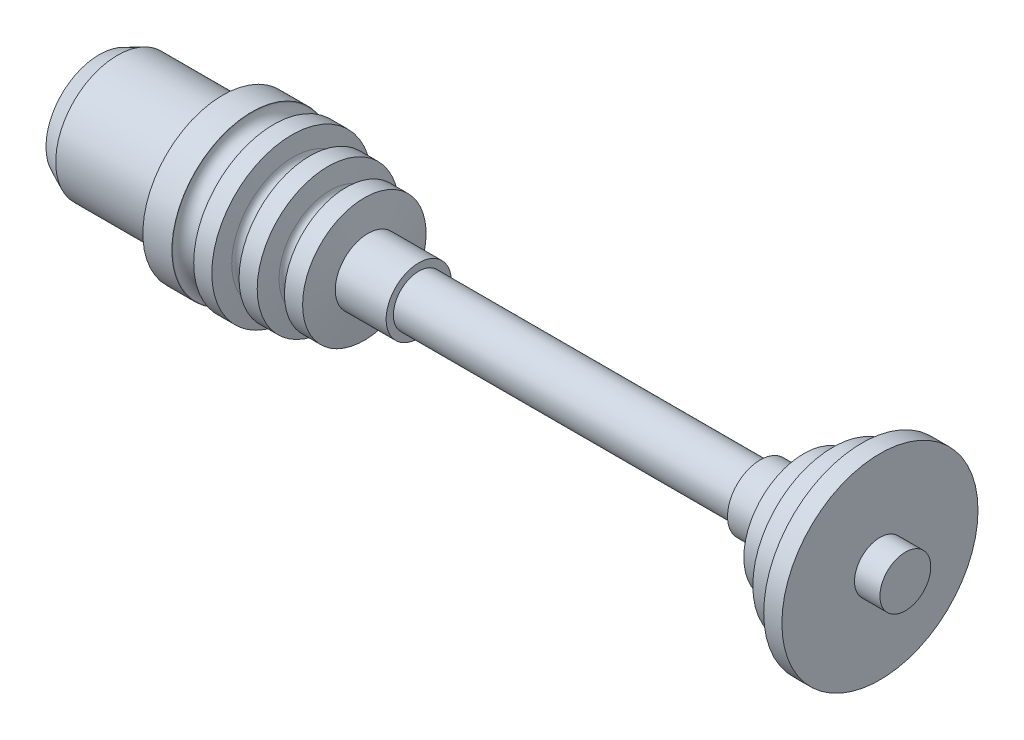
ISO-10303-21;
HEADER;
FILE_DESCRIPTION(('STEP AP214'),'2;1');
FILE_NAME('part.step','',(''),(''),'','','');
FILE_SCHEMA(('AUTOMOTIVE_DESIGN { 1 0 10303 214 1 1 1 1 }'));
ENDSEC;
DATA;
#1=APPLICATION_CONTEXT('core data for automotive mechanical design processes');
#2=APPLICATION_PROTOCOL_DEFINITION('international standard','automotive_design',2000,#1);
#3=PRODUCT_CONTEXT('',#1,'mechanical');
#4=PRODUCT('Part','Part','',(#3));
#5=PRODUCT_RELATED_PRODUCT_CATEGORY('part','',(#4));
#6=PRODUCT_DEFINITION_FORMATION('','',#4);
#7=PRODUCT_DEFINITION_CONTEXT('part definition',#1,'design');
#8=PRODUCT_DEFINITION('design','',#6,#7);
#9=PRODUCT_DEFINITION_SHAPE('','',#8);
#10=(LENGTH_UNIT() NAMED_UNIT(*) SI_UNIT(.MILLI.,.METRE.));
#11=(NAMED_UNIT(*) PLANE_ANGLE_UNIT() SI_UNIT($,.RADIAN.));
#12=(NAMED_UNIT(*) SI_UNIT($,.STERADIAN.) SOLID_ANGLE_UNIT());
#13=UNCERTAINTY_MEASURE_WITH_UNIT(LENGTH_MEASURE(1.E-05),#10,'distance_accuracy_value','');
#14=(GEOMETRIC_REPRESENTATION_CONTEXT(3) GLOBAL_UNCERTAINTY_ASSIGNED_CONTEXT((#13)) GLOBAL_UNIT_ASSIGNED_CONTEXT((#10,
#11,#12)) REPRESENTATION_CONTEXT('',''));
#15=CARTESIAN_POINT('',(0.,0.,0.));
#16=DIRECTION('',(0.,0.,1.));
#17=DIRECTION('',(1.,0.,0.));
#18=AXIS2_PLACEMENT_3D('',#15,#16,#17);
#19=CARTESIAN_POINT('',(2.9,0.,0.));
#20=DIRECTION('',(-1.,0.,0.));
#21=DIRECTION('',(0.,0.,1.));
#22=AXIS2_PLACEMENT_3D('',#19,#20,#21);
#23=CYLINDRICAL_SURFACE('',#22,1.7);
#24=CARTESIAN_POINT('',(2.9,0.,0.));
#25=DIRECTION('',(1.,0.,0.));
#26=DIRECTION('',(0.,0.,-1.));
#27=AXIS2_PLACEMENT_3D('',#24,#25,#26);
#28=CIRCLE('',#27,1.7);
#29=CARTESIAN_POINT('',(2.9,0.,-1.7));
#30=VERTEX_POINT('',#29);
#31=EDGE_CURVE('E61',#30,#30,#28,.T.);
#32=ORIENTED_EDGE('',*,*,#31,.F.);
#33=EDGE_LOOP('',(#32));
#34=FACE_BOUND('',#33,.T.);
#35=CARTESIAN_POINT('',(0.,0.,0.));
#36=DIRECTION('',(1.,0.,0.));
#37=DIRECTION('',(0.,0.,-1.));
#38=AXIS2_PLACEMENT_3D('',#35,#36,#37);
#39=CIRCLE('',#38,1.7);
#40=CARTESIAN_POINT('',(0.,0.,-1.7));
#41=VERTEX_POINT('',#40);
#42=EDGE_CURVE('E118',#41,#41,#39,.T.);
#43=ORIENTED_EDGE('',*,*,#42,.T.);
#44=EDGE_LOOP('',(#43));
#45=FACE_BOUND('',#44,.T.);
#46=ADVANCED_FACE('F50',(#34,#45),#23,.T.);
#47=CARTESIAN_POINT('',(3.7,0.,0.));
#48=DIRECTION('',(-1.,0.,0.));
#49=DIRECTION('',(0.,0.,1.));
#50=AXIS2_PLACEMENT_3D('',#47,#48,#49);
#51=CYLINDRICAL_SURFACE('',#50,2.2);
#52=CARTESIAN_POINT('',(3.7,0.,0.));
#53=DIRECTION('',(1.,0.,0.));
#54=DIRECTION('',(0.,0.,-1.));
#55=AXIS2_PLACEMENT_3D('',#52,#53,#54);
#56=CIRCLE('',#55,2.2);
#57=CARTESIAN_POINT('',(3.7,0.,-2.2));
#58=VERTEX_POINT('',#57);
#59=EDGE_CURVE('E103',#58,#58,#56,.T.);
#60=ORIENTED_EDGE('',*,*,#59,.F.);
#61=EDGE_LOOP('',(#60));
#62=FACE_BOUND('',#61,.T.);
#63=CARTESIAN_POINT('',(2.9,0.,0.));
#64=DIRECTION('',(1.,0.,0.));
#65=DIRECTION('',(0.,0.,-1.));
#66=AXIS2_PLACEMENT_3D('',#63,#64,#65);
#67=CIRCLE('',#66,2.2);
#68=CARTESIAN_POINT('',(2.9,0.,-2.2));
#69=VERTEX_POINT('',#68);
#70=EDGE_CURVE('E102',#69,#69,#67,.T.);
#71=ORIENTED_EDGE('',*,*,#70,.T.);
#72=EDGE_LOOP('',(#71));
#73=FACE_BOUND('',#72,.T.);
#74=ADVANCED_FACE('F115',(#62,#73),#51,.T.);
#75=CARTESIAN_POINT('',(3.7,0.,0.));
#76=DIRECTION('',(1.,0.,0.));
#77=DIRECTION('',(0.,0.,-1.));
#78=AXIS2_PLACEMENT_3D('',#75,#76,#77);
#79=PLANE('',#78);
#80=CARTESIAN_POINT('',(3.7,0.,0.));
#81=DIRECTION('',(-1.,0.,0.));
#82=DIRECTION('',(0.,0.,1.));
#83=AXIS2_PLACEMENT_3D('',#80,#81,#82);
#84=CIRCLE('',#83,2.18446778680125);
#85=CARTESIAN_POINT('',(3.7,0.,2.18446778680125));
#86=VERTEX_POINT('',#85);
#87=EDGE_CURVE('E53',#86,#86,#84,.F.);
#88=ORIENTED_EDGE('',*,*,#87,.F.);
#89=EDGE_LOOP('',(#88));
#90=FACE_BOUND('',#89,.T.);
#91=ORIENTED_EDGE('',*,*,#59,.T.);
#92=EDGE_LOOP('',(#91));
#93=FACE_BOUND('',#92,.T.);
#94=ADVANCED_FACE('F242',(#90,#93),#79,.T.);
#95=CARTESIAN_POINT('',(2.9,0.,0.));
#96=DIRECTION('',(1.,0.,0.));
#97=DIRECTION('',(0.,0.,-1.));
#98=AXIS2_PLACEMENT_3D('',#95,#96,#97);
#99=PLANE('',#98);
#100=ORIENTED_EDGE('',*,*,#31,.T.);
#101=EDGE_LOOP('',(#100));
#102=FACE_BOUND('',#101,.T.);
#103=ORIENTED_EDGE('',*,*,#70,.F.);
#104=EDGE_LOOP('',(#103));
#105=FACE_BOUND('',#104,.T.);
#106=ADVANCED_FACE('F110',(#102,#105),#99,.F.);
#107=CARTESIAN_POINT('',(6.04664733794712,0.,0.));
#108=DIRECTION('',(-1.,0.,0.));
#109=DIRECTION('',(0.,0.,1.));
#110=AXIS2_PLACEMENT_3D('',#107,#108,#109);
#111=TOROIDAL_SURFACE('',#110,1.43064535522847,0.188756587312078);
#112=CARTESIAN_POINT('',(6.23422555180458,0.,0.));
#113=DIRECTION('',(-1.,0.,0.));
#114=DIRECTION('',(0.,0.,1.));
#115=AXIS2_PLACEMENT_3D('',#112,#113,#114);
#116=CIRCLE('',#115,1.40958679545468);
#117=CARTESIAN_POINT('',(6.23422555180458,0.,1.40958679545468));
#118=VERTEX_POINT('',#117);
#119=EDGE_CURVE('E66',#118,#118,#116,.T.);
#120=ORIENTED_EDGE('',*,*,#119,.T.);
#121=EDGE_LOOP('',(#120));
#122=FACE_BOUND('',#121,.T.);
#123=CARTESIAN_POINT('',(5.85906912408965,0.,0.));
#124=DIRECTION('',(-1.,0.,0.));
#125=DIRECTION('',(0.,0.,1.));
#126=AXIS2_PLACEMENT_3D('',#123,#124,#125);
#127=CIRCLE('',#126,1.40958679545468);
#128=CARTESIAN_POINT('',(5.85906912408965,0.,1.40958679545468));
#129=VERTEX_POINT('',#128);
#130=EDGE_CURVE('E99',#129,#129,#127,.T.);
#131=ORIENTED_EDGE('',*,*,#130,.F.);
#132=EDGE_LOOP('',(#131));
#133=FACE_BOUND('',#132,.T.);
#134=ADVANCED_FACE('F237',(#122,#133),#111,.F.);
#135=CARTESIAN_POINT('',(5.79839937179576,0.,0.));
#136=DIRECTION('',(-1.,0.,0.));
#137=DIRECTION('',(0.,0.,1.));
#138=AXIS2_PLACEMENT_3D('',#135,#136,#137);
#139=CONICAL_SURFACE('',#138,1.95,1.45899895115095);
#140=ORIENTED_EDGE('',*,*,#130,.T.);
#141=EDGE_LOOP('',(#140));
#142=FACE_BOUND('',#141,.T.);
#143=CARTESIAN_POINT('',(5.79839937179576,0.,0.));
#144=DIRECTION('',(-1.,0.,0.));
#145=DIRECTION('',(0.,0.,1.));
#146=AXIS2_PLACEMENT_3D('',#143,#144,#145);
#147=CIRCLE('',#146,1.95);
#148=CARTESIAN_POINT('',(5.79839937179576,0.,1.95));
#149=VERTEX_POINT('',#148);
#150=EDGE_CURVE('E96',#149,#149,#147,.T.);
#151=ORIENTED_EDGE('',*,*,#150,.F.);
#152=EDGE_LOOP('',(#151));
#153=FACE_BOUND('',#152,.T.);
#154=ADVANCED_FACE('F233',(#142,#153),#139,.T.);
#155=CARTESIAN_POINT('',(-29.13128668451,0.,0.));
#156=DIRECTION('',(-1.,0.,0.));
#157=DIRECTION('',(0.,0.,1.));
#158=AXIS2_PLACEMENT_3D('',#155,#156,#157);
#159=CYLINDRICAL_SURFACE('',#158,1.95);
#160=ORIENTED_EDGE('',*,*,#150,.T.);
#161=EDGE_LOOP('',(#160));
#162=FACE_BOUND('',#161,.T.);
#163=CARTESIAN_POINT('',(5.29839937179576,0.,0.));
#164=DIRECTION('',(-1.,0.,0.));
#165=DIRECTION('',(0.,0.,1.));
#166=AXIS2_PLACEMENT_3D('',#163,#164,#165);
#167=CIRCLE('',#166,1.95);
#168=CARTESIAN_POINT('',(5.29839937179576,0.,1.95));
#169=VERTEX_POINT('',#168);
#170=EDGE_CURVE('E93',#169,#169,#167,.T.);
#171=ORIENTED_EDGE('',*,*,#170,.F.);
#172=EDGE_LOOP('',(#171));
#173=FACE_BOUND('',#172,.T.);
#174=ADVANCED_FACE('F229',(#162,#173),#159,.T.);
#175=CARTESIAN_POINT('',(5.29839937179576,0.,0.));
#176=DIRECTION('',(1.,0.,0.));
#177=DIRECTION('',(0.,0.,-1.));
#178=AXIS2_PLACEMENT_3D('',#175,#176,#177);
#179=CONICAL_SURFACE('',#178,1.95,1.40341113953658);
#180=CARTESIAN_POINT('',(5.25615783110607,0.,0.));
#181=DIRECTION('',(-1.,0.,0.));
#182=DIRECTION('',(0.,0.,1.));
#183=AXIS2_PLACEMENT_3D('',#180,#181,#182);
#184=CIRCLE('',#183,1.7);
#185=CARTESIAN_POINT('',(5.25615783110607,0.,1.7));
#186=VERTEX_POINT('',#185);
#187=EDGE_CURVE('E90',#186,#186,#184,.T.);
#188=ORIENTED_EDGE('',*,*,#187,.F.);
#189=EDGE_LOOP('',(#188));
#190=FACE_BOUND('',#189,.T.);
#191=ORIENTED_EDGE('',*,*,#170,.T.);
#192=EDGE_LOOP('',(#191));
#193=FACE_BOUND('',#192,.T.);
#194=ADVANCED_FACE('F225',(#190,#193),#179,.T.);
#195=CARTESIAN_POINT('',(5.05141662470216,0.,0.));
#196=DIRECTION('',(-1.,0.,0.));
#197=DIRECTION('',(0.,0.,1.));
#198=AXIS2_PLACEMENT_3D('',#195,#196,#197);
#199=TOROIDAL_SURFACE('',#198,1.71976819200266,0.205693322727754);
#200=ORIENTED_EDGE('',*,*,#187,.T.);
#201=EDGE_LOOP('',(#200));
#202=FACE_BOUND('',#201,.T.);
#203=CARTESIAN_POINT('',(4.84667541829825,0.,0.));
#204=DIRECTION('',(-1.,0.,0.));
#205=DIRECTION('',(0.,0.,1.));
#206=AXIS2_PLACEMENT_3D('',#203,#204,#205);
#207=CIRCLE('',#206,1.7);
#208=CARTESIAN_POINT('',(4.84667541829825,0.,1.7));
#209=VERTEX_POINT('',#208);
#210=EDGE_CURVE('E87',#209,#209,#207,.T.);
#211=ORIENTED_EDGE('',*,*,#210,.F.);
#212=EDGE_LOOP('',(#211));
#213=FACE_BOUND('',#212,.T.);
#214=ADVANCED_FACE('F221',(#202,#213),#199,.F.);
#215=CARTESIAN_POINT('',(4.79839937179576,0.,0.));
#216=DIRECTION('',(-1.,0.,0.));
#217=DIRECTION('',(0.,0.,1.));
#218=AXIS2_PLACEMENT_3D('',#215,#216,#217);
#219=CONICAL_SURFACE('',#218,2.2,1.47454259611114);
#220=ORIENTED_EDGE('',*,*,#210,.T.);
#221=EDGE_LOOP('',(#220));
#222=FACE_BOUND('',#221,.T.);
#223=CARTESIAN_POINT('',(4.79839937179576,0.,0.));
#224=DIRECTION('',(-1.,0.,0.));
#225=DIRECTION('',(0.,0.,1.));
#226=AXIS2_PLACEMENT_3D('',#223,#224,#225);
#227=CIRCLE('',#226,2.2);
#228=CARTESIAN_POINT('',(4.79839937179576,0.,2.2));
#229=VERTEX_POINT('',#228);
#230=EDGE_CURVE('E84',#229,#229,#227,.T.);
#231=ORIENTED_EDGE('',*,*,#230,.F.);
#232=EDGE_LOOP('',(#231));
#233=FACE_BOUND('',#232,.T.);
#234=ADVANCED_FACE('F217',(#222,#233),#219,.T.);
#235=CARTESIAN_POINT('',(-29.13128668451,0.,0.));
#236=DIRECTION('',(-1.,0.,0.));
#237=DIRECTION('',(0.,0.,1.));
#238=AXIS2_PLACEMENT_3D('',#235,#236,#237);
#239=CYLINDRICAL_SURFACE('',#238,2.2);
#240=ORIENTED_EDGE('',*,*,#230,.T.);
#241=EDGE_LOOP('',(#240));
#242=FACE_BOUND('',#241,.T.);
#243=CARTESIAN_POINT('',(4.3,0.,0.));
#244=DIRECTION('',(-1.,0.,0.));
#245=DIRECTION('',(0.,0.,1.));
#246=AXIS2_PLACEMENT_3D('',#243,#244,#245);
#247=CIRCLE('',#246,2.2);
#248=CARTESIAN_POINT('',(4.3,0.,2.2));
#249=VERTEX_POINT('',#248);
#250=EDGE_CURVE('E81',#249,#249,#247,.T.);
#251=ORIENTED_EDGE('',*,*,#250,.F.);
#252=EDGE_LOOP('',(#251));
#253=FACE_BOUND('',#252,.T.);
#254=ADVANCED_FACE('F213',(#242,#253),#239,.T.);
#255=CARTESIAN_POINT('',(4.,0.,0.));
#256=DIRECTION('',(-1.,0.,0.));
#257=DIRECTION('',(0.,0.,1.));
#258=AXIS2_PLACEMENT_3D('',#255,#256,#257);
#259=TOROIDAL_SURFACE('',#258,2.19223389340062,0.300100503851148);
#260=ORIENTED_EDGE('',*,*,#87,.T.);
#261=EDGE_LOOP('',(#260));
#262=FACE_BOUND('',#261,.T.);
#263=ORIENTED_EDGE('',*,*,#250,.T.);
#264=EDGE_LOOP('',(#263));
#265=FACE_BOUND('',#264,.T.);
#266=ADVANCED_FACE('F209',(#262,#265),#259,.F.);
#267=CARTESIAN_POINT('',(8.29781286455028,0.,0.));
#268=DIRECTION('',(1.,0.,0.));
#269=DIRECTION('',(0.,0.,-1.));
#270=AXIS2_PLACEMENT_3D('',#267,#268,#269);
#271=PLANE('',#270);
#272=CARTESIAN_POINT('',(8.29781286455028,0.,0.));
#273=DIRECTION('',(1.,0.,0.));
#274=DIRECTION('',(0.,0.,-1.));
#275=AXIS2_PLACEMENT_3D('',#272,#273,#274);
#276=CIRCLE('',#275,0.7);
#277=CARTESIAN_POINT('',(8.29781286455028,0.,-0.7));
#278=VERTEX_POINT('',#277);
#279=EDGE_CURVE('E11',#278,#278,#276,.T.);
#280=ORIENTED_EDGE('',*,*,#279,.F.);
#281=EDGE_LOOP('',(#280));
#282=FACE_BOUND('',#281,.T.);
#283=CARTESIAN_POINT('',(8.29781286455028,0.,0.));
#284=DIRECTION('',(-1.,0.,0.));
#285=DIRECTION('',(0.,0.,1.));
#286=AXIS2_PLACEMENT_3D('',#283,#284,#285);
#287=CIRCLE('',#286,0.9);
#288=CARTESIAN_POINT('',(8.29781286455028,0.,0.9));
#289=VERTEX_POINT('',#288);
#290=EDGE_CURVE('E78',#289,#289,#287,.T.);
#291=ORIENTED_EDGE('',*,*,#290,.F.);
#292=EDGE_LOOP('',(#291));
#293=FACE_BOUND('',#292,.T.);
#294=ADVANCED_FACE('F205',(#282,#293),#271,.T.);
#295=CARTESIAN_POINT('',(-29.13128668451,0.,0.));
#296=DIRECTION('',(-1.,0.,0.));
#297=DIRECTION('',(0.,0.,1.));
#298=AXIS2_PLACEMENT_3D('',#295,#296,#297);
#299=CYLINDRICAL_SURFACE('',#298,0.9);
#300=ORIENTED_EDGE('',*,*,#290,.T.);
#301=EDGE_LOOP('',(#300));
#302=FACE_BOUND('',#301,.T.);
#303=CARTESIAN_POINT('',(6.89781286455028,0.,0.));
#304=DIRECTION('',(-1.,0.,0.));
#305=DIRECTION('',(0.,0.,1.));
#306=AXIS2_PLACEMENT_3D('',#303,#304,#305);
#307=CIRCLE('',#306,0.9);
#308=CARTESIAN_POINT('',(6.89781286455028,0.,0.9));
#309=VERTEX_POINT('',#308);
#310=EDGE_CURVE('E75',#309,#309,#307,.T.);
#311=ORIENTED_EDGE('',*,*,#310,.F.);
#312=EDGE_LOOP('',(#311));
#313=FACE_BOUND('',#312,.T.);
#314=ADVANCED_FACE('F201',(#302,#313),#299,.T.);
#315=CARTESIAN_POINT('',(6.79839937179576,0.,0.));
#316=DIRECTION('',(-1.,0.,0.));
#317=DIRECTION('',(0.,0.,1.));
#318=AXIS2_PLACEMENT_3D('',#315,#316,#317);
#319=CONICAL_SURFACE('',#318,1.7,1.44716325233431);
#320=ORIENTED_EDGE('',*,*,#310,.T.);
#321=EDGE_LOOP('',(#320));
#322=FACE_BOUND('',#321,.T.);
#323=CARTESIAN_POINT('',(6.79839937179576,0.,0.));
#324=DIRECTION('',(-1.,0.,0.));
#325=DIRECTION('',(0.,0.,1.));
#326=AXIS2_PLACEMENT_3D('',#323,#324,#325);
#327=CIRCLE('',#326,1.7);
#328=CARTESIAN_POINT('',(6.79839937179576,0.,1.7));
#329=VERTEX_POINT('',#328);
#330=EDGE_CURVE('E72',#329,#329,#327,.T.);
#331=ORIENTED_EDGE('',*,*,#330,.F.);
#332=EDGE_LOOP('',(#331));
#333=FACE_BOUND('',#332,.T.);
#334=ADVANCED_FACE('F197',(#322,#333),#319,.T.);
#335=CARTESIAN_POINT('',(-29.13128668451,0.,0.));
#336=DIRECTION('',(-1.,0.,0.));
#337=DIRECTION('',(0.,0.,1.));
#338=AXIS2_PLACEMENT_3D('',#335,#336,#337);
#339=CYLINDRICAL_SURFACE('',#338,1.7);
#340=ORIENTED_EDGE('',*,*,#330,.T.);
#341=EDGE_LOOP('',(#340));
#342=FACE_BOUND('',#341,.T.);
#343=CARTESIAN_POINT('',(6.29839937179576,0.,0.));
#344=DIRECTION('',(-1.,0.,0.));
#345=DIRECTION('',(0.,0.,1.));
#346=AXIS2_PLACEMENT_3D('',#343,#344,#345);
#347=CIRCLE('',#346,1.7);
#348=CARTESIAN_POINT('',(6.29839937179576,0.,1.7));
#349=VERTEX_POINT('',#348);
#350=EDGE_CURVE('E69',#349,#349,#347,.T.);
#351=ORIENTED_EDGE('',*,*,#350,.F.);
#352=EDGE_LOOP('',(#351));
#353=FACE_BOUND('',#352,.T.);
#354=ADVANCED_FACE('F193',(#342,#353),#339,.T.);
#355=CARTESIAN_POINT('',(6.29839937179576,0.,0.));
#356=DIRECTION('',(1.,0.,0.));
#357=DIRECTION('',(0.,0.,-1.));
#358=AXIS2_PLACEMENT_3D('',#355,#356,#357);
#359=CONICAL_SURFACE('',#358,1.7,1.35331700475172);
#360=ORIENTED_EDGE('',*,*,#119,.F.);
#361=EDGE_LOOP('',(#360));
#362=FACE_BOUND('',#361,.T.);
#363=ORIENTED_EDGE('',*,*,#350,.T.);
#364=EDGE_LOOP('',(#363));
#365=FACE_BOUND('',#364,.T.);
#366=ADVANCED_FACE('F189',(#362,#365),#359,.T.);
#367=CARTESIAN_POINT('',(17.6978128645503,0.,0.));
#368=DIRECTION('',(-1.,0.,0.));
#369=DIRECTION('',(0.,0.,1.));
#370=AXIS2_PLACEMENT_3D('',#367,#368,#369);
#371=CYLINDRICAL_SURFACE('',#370,0.7);
#372=CARTESIAN_POINT('',(17.6978128645503,0.,0.));
#373=DIRECTION('',(1.,0.,0.));
#374=DIRECTION('',(0.,0.,-1.));
#375=AXIS2_PLACEMENT_3D('',#372,#373,#374);
#376=CIRCLE('',#375,0.7);
#377=CARTESIAN_POINT('',(17.6978128645503,0.,-0.7));
#378=VERTEX_POINT('',#377);
#379=EDGE_CURVE('E64',#378,#378,#376,.T.);
#380=ORIENTED_EDGE('',*,*,#379,.F.);
#381=EDGE_LOOP('',(#380));
#382=FACE_BOUND('',#381,.T.);
#383=ORIENTED_EDGE('',*,*,#279,.T.);
#384=EDGE_LOOP('',(#383));
#385=FACE_BOUND('',#384,.T.);
#386=ADVANCED_FACE('F181',(#382,#385),#371,.T.);
#387=CARTESIAN_POINT('',(18.8978128645503,0.,0.));
#388=DIRECTION('',(-1.,0.,0.));
#389=DIRECTION('',(0.,0.,1.));
#390=AXIS2_PLACEMENT_3D('',#387,#388,#389);
#391=CYLINDRICAL_SURFACE('',#390,0.9);
#392=CARTESIAN_POINT('',(18.8978128645503,0.,0.));
#393=DIRECTION('',(1.,0.,0.));
#394=DIRECTION('',(0.,0.,-1.));
#395=AXIS2_PLACEMENT_3D('',#392,#393,#394);
#396=CIRCLE('',#395,0.9);
#397=CARTESIAN_POINT('',(18.8978128645503,0.,-0.9));
#398=VERTEX_POINT('',#397);
#399=EDGE_CURVE('E162',#398,#398,#396,.T.);
#400=ORIENTED_EDGE('',*,*,#399,.F.);
#401=EDGE_LOOP('',(#400));
#402=FACE_BOUND('',#401,.T.);
#403=CARTESIAN_POINT('',(17.6978128645503,0.,0.));
#404=DIRECTION('',(1.,0.,0.));
#405=DIRECTION('',(0.,0.,-1.));
#406=AXIS2_PLACEMENT_3D('',#403,#404,#405);
#407=CIRCLE('',#406,0.9);
#408=CARTESIAN_POINT('',(17.6978128645503,0.,-0.9));
#409=VERTEX_POINT('',#408);
#410=EDGE_CURVE('E161',#409,#409,#407,.T.);
#411=ORIENTED_EDGE('',*,*,#410,.T.);
#412=EDGE_LOOP('',(#411));
#413=FACE_BOUND('',#412,.T.);
#414=ADVANCED_FACE('F167',(#402,#413),#391,.T.);
#415=CARTESIAN_POINT('',(17.6978128645503,0.,0.));
#416=DIRECTION('',(1.,0.,0.));
#417=DIRECTION('',(0.,0.,-1.));
#418=AXIS2_PLACEMENT_3D('',#415,#416,#417);
#419=PLANE('',#418);
#420=ORIENTED_EDGE('',*,*,#379,.T.);
#421=EDGE_LOOP('',(#420));
#422=FACE_BOUND('',#421,.T.);
#423=ORIENTED_EDGE('',*,*,#410,.F.);
#424=EDGE_LOOP('',(#423));
#425=FACE_BOUND('',#424,.T.);
#426=ADVANCED_FACE('F169',(#422,#425),#419,.F.);
#427=CARTESIAN_POINT('',(18.8978128645503,1.65,0.));
#428=DIRECTION('',(1.,0.,0.));
#429=DIRECTION('',(0.,0.,-1.));
#430=AXIS2_PLACEMENT_3D('',#427,#428,#429);
#431=PLANE('',#430);
#432=ORIENTED_EDGE('',*,*,#399,.T.);
#433=EDGE_LOOP('',(#432));
#434=FACE_BOUND('',#433,.T.);
#435=CARTESIAN_POINT('',(18.8978128645503,0.,0.));
#436=DIRECTION('',(-1.,0.,0.));
#437=DIRECTION('',(0.,0.,1.));
#438=AXIS2_PLACEMENT_3D('',#435,#436,#437);
#439=CIRCLE('',#438,1.65);
#440=CARTESIAN_POINT('',(18.8978128645503,0.,1.65));
#441=VERTEX_POINT('',#440);
#442=EDGE_CURVE('E123',#441,#441,#439,.T.);
#443=ORIENTED_EDGE('',*,*,#442,.T.);
#444=EDGE_LOOP('',(#443));
#445=FACE_BOUND('',#444,.T.);
#446=ADVANCED_FACE('F171',(#434,#445),#431,.F.);
#447=CARTESIAN_POINT('',(21.6948619475637,0.7,0.));
#448=DIRECTION('',(-1.,0.,0.));
#449=DIRECTION('',(0.,0.,1.));
#450=AXIS2_PLACEMENT_3D('',#447,#448,#449);
#451=PLANE('',#450);
#452=CARTESIAN_POINT('',(21.6948619475637,0.,0.));
#453=DIRECTION('',(-1.,0.,0.));
#454=DIRECTION('',(0.,0.,1.));
#455=AXIS2_PLACEMENT_3D('',#452,#453,#454);
#456=CIRCLE('',#455,0.7);
#457=CARTESIAN_POINT('',(21.6948619475637,0.,0.7));
#458=VERTEX_POINT('',#457);
#459=EDGE_CURVE('E158',#458,#458,#456,.T.);
#460=ORIENTED_EDGE('',*,*,#459,.F.);
#461=EDGE_LOOP('',(#460));
#462=FACE_BOUND('',#461,.T.);
#463=ADVANCED_FACE('F178',(#462),#451,.F.);
#464=CARTESIAN_POINT('',(-29.13128668451,0.,0.));
#465=DIRECTION('',(-1.,0.,0.));
#466=DIRECTION('',(0.,0.,1.));
#467=AXIS2_PLACEMENT_3D('',#464,#465,#466);
#468=CYLINDRICAL_SURFACE('',#467,0.7);
#469=CARTESIAN_POINT('',(20.9948619475637,0.,0.));
#470=DIRECTION('',(-1.,0.,0.));
#471=DIRECTION('',(0.,0.,1.));
#472=AXIS2_PLACEMENT_3D('',#469,#470,#471);
#473=CIRCLE('',#472,0.7);
#474=CARTESIAN_POINT('',(20.9948619475637,0.,0.7));
#475=VERTEX_POINT('',#474);
#476=EDGE_CURVE('E155',#475,#475,#473,.T.);
#477=ORIENTED_EDGE('',*,*,#476,.F.);
#478=EDGE_LOOP('',(#477));
#479=FACE_BOUND('',#478,.T.);
#480=ORIENTED_EDGE('',*,*,#459,.T.);
#481=EDGE_LOOP('',(#480));
#482=FACE_BOUND('',#481,.T.);
#483=ADVANCED_FACE('F344',(#479,#482),#468,.T.);
#484=CARTESIAN_POINT('',(20.9948619475637,2.7,0.));
#485=DIRECTION('',(-1.,0.,0.));
#486=DIRECTION('',(0.,0.,1.));
#487=AXIS2_PLACEMENT_3D('',#484,#485,#486);
#488=PLANE('',#487);
#489=CARTESIAN_POINT('',(20.9948619475637,0.,0.));
#490=DIRECTION('',(-1.,0.,0.));
#491=DIRECTION('',(0.,0.,1.));
#492=AXIS2_PLACEMENT_3D('',#489,#490,#491);
#493=CIRCLE('',#492,2.7);
#494=CARTESIAN_POINT('',(20.9948619475637,0.,2.7));
#495=VERTEX_POINT('',#494);
#496=EDGE_CURVE('E152',#495,#495,#493,.T.);
#497=ORIENTED_EDGE('',*,*,#496,.F.);
#498=EDGE_LOOP('',(#497));
#499=FACE_BOUND('',#498,.T.);
#500=ORIENTED_EDGE('',*,*,#476,.T.);
#501=EDGE_LOOP('',(#500));
#502=FACE_BOUND('',#501,.T.);
#503=ADVANCED_FACE('F353',(#499,#502),#488,.F.);
#504=CARTESIAN_POINT('',(-29.13128668451,0.,0.));
#505=DIRECTION('',(-1.,0.,0.));
#506=DIRECTION('',(0.,0.,1.));
#507=AXIS2_PLACEMENT_3D('',#504,#505,#506);
#508=CYLINDRICAL_SURFACE('',#507,2.7);
#509=CARTESIAN_POINT('',(20.4948619475637,0.,0.));
#510=DIRECTION('',(-1.,0.,0.));
#511=DIRECTION('',(0.,0.,1.));
#512=AXIS2_PLACEMENT_3D('',#509,#510,#511);
#513=CIRCLE('',#512,2.7);
#514=CARTESIAN_POINT('',(20.4948619475637,0.,-2.70000000000007));
#515=VERTEX_POINT('',#514);
#516=EDGE_CURVE('E149',#515,#515,#513,.T.);
#517=ORIENTED_EDGE('',*,*,#516,.F.);
#518=EDGE_LOOP('',(#517));
#519=FACE_BOUND('',#518,.T.);
#520=ORIENTED_EDGE('',*,*,#496,.T.);
#521=EDGE_LOOP('',(#520));
#522=FACE_BOUND('',#521,.T.);
#523=ADVANCED_FACE('F363',(#519,#522),#508,.T.);
#524=CARTESIAN_POINT('',(20.4948619475637,0.,0.));
#525=DIRECTION('',(1.,0.,0.));
#526=DIRECTION('',(0.,0.,-1.));
#527=AXIS2_PLACEMENT_3D('',#524,#525,#526);
#528=CONICAL_SURFACE('',#527,2.7,1.5442878941312);
#529=CARTESIAN_POINT('',(20.4454264650894,0.,0.));
#530=DIRECTION('',(-1.,0.,0.));
#531=DIRECTION('',(0.,0.,1.));
#532=AXIS2_PLACEMENT_3D('',#529,#530,#531);
#533=CIRCLE('',#532,0.83554037047756);
#534=CARTESIAN_POINT('',(20.4454264650894,0.,-0.835540370477632));
#535=VERTEX_POINT('',#534);
#536=EDGE_CURVE('E146',#535,#535,#533,.T.);
#537=CARTESIAN_POINT('',(20.4454264650894,0.,-0.835540370477632));
#538=CARTESIAN_POINT('',(20.4459414180318,0.,-0.854961824951824));
#539=CARTESIAN_POINT('',(20.4464563709743,0.,-0.874383279426016));
#540=CARTESIAN_POINT('',(20.4474862768591,0.,-0.9132261883744));
#541=CARTESIAN_POINT('',(20.4480012298016,0.,-0.932647642848592));
#542=CARTESIAN_POINT('',(20.4490311356865,0.,-0.971490551796976));
#543=CARTESIAN_POINT('',(20.4495460886289,0.,-0.990912006271168));
#544=CARTESIAN_POINT('',(20.4505759945138,0.,-1.02975491521955));
#545=CARTESIAN_POINT('',(20.4510909474562,0.,-1.04917636969374));
#546=CARTESIAN_POINT('',(20.4521208533411,0.,-1.08801927864213));
#547=CARTESIAN_POINT('',(20.4526358062835,0.,-1.10744073311632));
#548=CARTESIAN_POINT('',(20.4536657121684,0.,-1.1462836420647));
#549=CARTESIAN_POINT('',(20.4541806651109,0.,-1.1657050965389));
#550=CARTESIAN_POINT('',(20.4552105709957,0.,-1.20454800548728));
#551=CARTESIAN_POINT('',(20.4557255239382,0.,-1.22396945996147));
#552=CARTESIAN_POINT('',(20.4567554298231,0.,-1.26281236890986));
#553=CARTESIAN_POINT('',(20.4572703827655,0.,-1.28223382338405));
#554=CARTESIAN_POINT('',(20.4583002886504,0.,-1.32107673233243));
#555=CARTESIAN_POINT('',(20.4588152415928,0.,-1.34049818680662));
#556=CARTESIAN_POINT('',(20.4598451474777,0.,-1.37934109575501));
#557=CARTESIAN_POINT('',(20.4603601004202,0.,-1.3987625502292));
#558=CARTESIAN_POINT('',(20.461390006305,0.,-1.43760545917758));
#559=CARTESIAN_POINT('',(20.4619049592475,0.,-1.45702691365178));
#560=CARTESIAN_POINT('',(20.4629348651324,0.,-1.49586982260016));
#561=CARTESIAN_POINT('',(20.4634498180748,0.,-1.51529127707435));
#562=CARTESIAN_POINT('',(20.4644797239597,0.,-1.55413418602274));
#563=CARTESIAN_POINT('',(20.4649946769021,0.,-1.57355564049693));
#564=CARTESIAN_POINT('',(20.466024582787,0.,-1.61239854944531));
#565=CARTESIAN_POINT('',(20.4665395357294,0.,-1.6318200039195));
#566=CARTESIAN_POINT('',(20.4675694416143,0.,-1.67066291286789));
#567=CARTESIAN_POINT('',(20.4680843945568,0.,-1.69008436734208));
#568=CARTESIAN_POINT('',(20.4691143004416,0.,-1.72892727629046));
#569=CARTESIAN_POINT('',(20.4696292533841,0.,-1.74834873076466));
#570=CARTESIAN_POINT('',(20.470659159269,0.,-1.78719163971304));
#571=CARTESIAN_POINT('',(20.4711741122114,0.,-1.80661309418723));
#572=CARTESIAN_POINT('',(20.4722040180963,0.,-1.84545600313562));
#573=CARTESIAN_POINT('',(20.4727189710387,0.,-1.86487745760981));
#574=CARTESIAN_POINT('',(20.4737488769236,0.,-1.90372036655819));
#575=CARTESIAN_POINT('',(20.474263829866,0.,-1.92314182103238));
#576=CARTESIAN_POINT('',(20.4752937357509,0.,-1.96198472998077));
#577=CARTESIAN_POINT('',(20.4758086886934,0.,-1.98140618445496));
#578=CARTESIAN_POINT('',(20.4768385945783,0.,-2.02024909340334));
#579=CARTESIAN_POINT('',(20.4773535475207,0.,-2.03967054787754));
#580=CARTESIAN_POINT('',(20.4783834534056,0.,-2.07851345682592));
#581=CARTESIAN_POINT('',(20.478898406348,0.,-2.09793491130011));
#582=CARTESIAN_POINT('',(20.4799283122329,0.,-2.1367778202485));
#583=CARTESIAN_POINT('',(20.4804432651753,0.,-2.15619927472269));
#584=CARTESIAN_POINT('',(20.4814731710602,0.,-2.19504218367107));
#585=CARTESIAN_POINT('',(20.4819881240027,0.,-2.21446363814527));
#586=CARTESIAN_POINT('',(20.4830180298875,0.,-2.25330654709365));
#587=CARTESIAN_POINT('',(20.48353298283,0.,-2.27272800156784));
#588=CARTESIAN_POINT('',(20.4845628887149,0.,-2.31157091051623));
#589=CARTESIAN_POINT('',(20.4850778416573,0.,-2.33099236499042));
#590=CARTESIAN_POINT('',(20.4861077475422,0.,-2.3698352739388));
#591=CARTESIAN_POINT('',(20.4866227004846,0.,-2.38925672841299));
#592=CARTESIAN_POINT('',(20.4876526063695,0.,-2.42809963736138));
#593=CARTESIAN_POINT('',(20.4881675593119,0.,-2.44752109183557));
#594=CARTESIAN_POINT('',(20.4891974651968,0.,-2.48636400078395));
#595=CARTESIAN_POINT('',(20.4897124181393,0.,-2.50578545525815));
#596=CARTESIAN_POINT('',(20.4907423240242,0.,-2.54462836420653));
#597=CARTESIAN_POINT('',(20.4912572769666,0.,-2.56404981868072));
#598=CARTESIAN_POINT('',(20.4922871828515,0.,-2.60289272762911));
#599=CARTESIAN_POINT('',(20.4928021357939,0.,-2.6223141821033));
#600=CARTESIAN_POINT('',(20.4938320416788,0.,-2.66115709105168));
#601=CARTESIAN_POINT('',(20.4943469946212,0.,-2.68057854552587));
#602=CARTESIAN_POINT('',(20.4948619475637,0.,-2.70000000000007));
#603=B_SPLINE_CURVE_WITH_KNOTS('',3,(#537,#538,#539,#540,#541,#542,#543,#544,#545,#546,#547,
#548,#549,#550,#551,#552,#553,#554,#555,#556,#557,#558,#559,#560,#561,#562,#563,#564,#565,#566,
#567,#568,#569,#570,#571,#572,#573,#574,#575,#576,#577,#578,#579,#580,#581,#582,#583,#584,#585,
#586,#587,#588,#589,#590,#591,#592,#593,#594,#595,#596,#597,#598,#599,#600,#601,#602),
.UNSPECIFIED.,.F.,.F.,(4,2,2,2,2,2,2,2,2,2,2,2,2,2,2,2,2,2,2,2,2,2,2,2,2,2,2,2,2,2,2,2,4),(0.,
0.0582848405147888,0.116569681029578,0.174854521544366,0.233139362059155,0.291424202573944,
0.349709043088733,0.407993883603522,0.466278724118311,0.5245635646331,0.582848405147889,
0.641133245662677,0.699418086177466,0.757702926692255,0.815987767207044,0.874272607721833,
0.932557448236621,0.99084228875141,1.0491271292662,1.10741196978099,1.16569681029578,
1.22398165081057,1.28226649132535,1.34055133184014,1.39883617235493,1.45712101286972,
1.51540585338451,1.5736906938993,1.63197553441409,1.69026037492888,1.74854521544367,
1.80683005595845,1.86511489647324),.UNSPECIFIED.);
#604=EDGE_CURVE('BSEAM373',#535,#515,#603,.T.);
#605=ORIENTED_EDGE('',*,*,#536,.F.);
#606=ORIENTED_EDGE('',*,*,#516,.T.);
#607=ORIENTED_EDGE('',*,*,#604,.T.);
#608=ORIENTED_EDGE('',*,*,#604,.F.);
#609=EDGE_LOOP('',(#605,#607,#606,#608));
#610=FACE_BOUND('',#609,.T.);
#611=ADVANCED_FACE('F373',(#610),#528,.T.);
#612=CARTESIAN_POINT('',(20.3716567813658,0.,0.));
#613=DIRECTION('',(-1.,0.,0.));
#614=DIRECTION('',(0.,0.,1.));
#615=AXIS2_PLACEMENT_3D('',#612,#613,#614);
#616=TOROIDAL_SURFACE('',#615,0.86406021109621,0.0790907551208754);
#617=CARTESIAN_POINT('',(20.2927757970398,0.,0.));
#618=DIRECTION('',(-1.,0.,0.));
#619=DIRECTION('',(0.,0.,1.));
#620=AXIS2_PLACEMENT_3D('',#617,#618,#619);
#621=CIRCLE('',#620,0.858303662011933);
#622=CARTESIAN_POINT('',(20.2927757970398,0.,0.858303662011933));
#623=VERTEX_POINT('',#622);
#624=EDGE_CURVE('E143',#623,#623,#621,.T.);
#625=ORIENTED_EDGE('',*,*,#624,.F.);
#626=EDGE_LOOP('',(#625));
#627=FACE_BOUND('',#626,.T.);
#628=ORIENTED_EDGE('',*,*,#536,.T.);
#629=EDGE_LOOP('',(#628));
#630=FACE_BOUND('',#629,.T.);
#631=ADVANCED_FACE('F383',(#627,#630),#616,.F.);
#632=CARTESIAN_POINT('',(20.2927757970398,0.,0.));
#633=DIRECTION('',(-1.,0.,0.));
#634=DIRECTION('',(0.,0.,1.));
#635=AXIS2_PLACEMENT_3D('',#632,#633,#634);
#636=CONICAL_SURFACE('',#635,0.858303662011933,1.49794781489476);
#637=CARTESIAN_POINT('',(20.1948619475637,0.,0.));
#638=DIRECTION('',(-1.,0.,0.));
#639=DIRECTION('',(0.,0.,1.));
#640=AXIS2_PLACEMENT_3D('',#637,#638,#639);
#641=CIRCLE('',#640,2.2);
#642=CARTESIAN_POINT('',(20.1948619475637,0.,2.2));
#643=VERTEX_POINT('',#642);
#644=EDGE_CURVE('E140',#643,#643,#641,.T.);
#645=ORIENTED_EDGE('',*,*,#644,.F.);
#646=EDGE_LOOP('',(#645));
#647=FACE_BOUND('',#646,.T.);
#648=ORIENTED_EDGE('',*,*,#624,.T.);
#649=EDGE_LOOP('',(#648));
#650=FACE_BOUND('',#649,.T.);
#651=ADVANCED_FACE('F393',(#647,#650),#636,.T.);
#652=CARTESIAN_POINT('',(-29.13128668451,0.,0.));
#653=DIRECTION('',(-1.,0.,0.));
#654=DIRECTION('',(0.,0.,1.));
#655=AXIS2_PLACEMENT_3D('',#652,#653,#654);
#656=CYLINDRICAL_SURFACE('',#655,2.2);
#657=CARTESIAN_POINT('',(19.6948619475637,0.,0.));
#658=DIRECTION('',(-1.,0.,0.));
#659=DIRECTION('',(0.,0.,1.));
#660=AXIS2_PLACEMENT_3D('',#657,#658,#659);
#661=CIRCLE('',#660,2.2);
#662=CARTESIAN_POINT('',(19.6948619475637,0.,2.2));
#663=VERTEX_POINT('',#662);
#664=EDGE_CURVE('E137',#663,#663,#661,.T.);
#665=ORIENTED_EDGE('',*,*,#664,.F.);
#666=EDGE_LOOP('',(#665));
#667=FACE_BOUND('',#666,.T.);
#668=ORIENTED_EDGE('',*,*,#644,.T.);
#669=EDGE_LOOP('',(#668));
#670=FACE_BOUND('',#669,.T.);
#671=ADVANCED_FACE('F403',(#667,#670),#656,.T.);
#672=CARTESIAN_POINT('',(19.6948619475637,0.,0.));
#673=DIRECTION('',(1.,0.,0.));
#674=DIRECTION('',(0.,0.,-1.));
#675=AXIS2_PLACEMENT_3D('',#672,#673,#674);
#676=CONICAL_SURFACE('',#675,2.2,1.50066874647617);
#677=CARTESIAN_POINT('',(19.6104453163031,0.,0.));
#678=DIRECTION('',(-1.,0.,0.));
#679=DIRECTION('',(0.,0.,1.));
#680=AXIS2_PLACEMENT_3D('',#677,#678,#679);
#681=CIRCLE('',#680,0.998216023781803);
#682=CARTESIAN_POINT('',(19.6104453163031,0.,0.998216023781803));
#683=VERTEX_POINT('',#682);
#684=EDGE_CURVE('E134',#683,#683,#681,.T.);
#685=ORIENTED_EDGE('',*,*,#684,.F.);
#686=EDGE_LOOP('',(#685));
#687=FACE_BOUND('',#686,.T.);
#688=ORIENTED_EDGE('',*,*,#664,.T.);
#689=EDGE_LOOP('',(#688));
#690=FACE_BOUND('',#689,.T.);
#691=ADVANCED_FACE('F413',(#687,#690),#676,.T.);
#692=CARTESIAN_POINT('',(19.5470499493685,0.,0.));
#693=DIRECTION('',(-1.,0.,0.));
#694=DIRECTION('',(0.,0.,1.));
#695=AXIS2_PLACEMENT_3D('',#692,#693,#694);
#696=TOROIDAL_SURFACE('',#695,1.02144507333093,0.0675171185087718);
#697=CARTESIAN_POINT('',(19.4800887176747,0.,0.));
#698=DIRECTION('',(-1.,0.,0.));
#699=DIRECTION('',(0.,0.,1.));
#700=AXIS2_PLACEMENT_3D('',#697,#698,#699);
#701=CIRCLE('',#700,1.01279899087814);
#702=CARTESIAN_POINT('',(19.4800887176747,0.,1.01279899087814));
#703=VERTEX_POINT('',#702);
#704=EDGE_CURVE('E131',#703,#703,#701,.T.);
#705=ORIENTED_EDGE('',*,*,#704,.F.);
#706=EDGE_LOOP('',(#705));
#707=FACE_BOUND('',#706,.T.);
#708=ORIENTED_EDGE('',*,*,#684,.T.);
#709=EDGE_LOOP('',(#708));
#710=FACE_BOUND('',#709,.T.);
#711=ADVANCED_FACE('F423',(#707,#710),#696,.F.);
#712=CARTESIAN_POINT('',(19.4800887176747,0.,0.));
#713=DIRECTION('',(-1.,0.,0.));
#714=DIRECTION('',(0.,0.,1.));
#715=AXIS2_PLACEMENT_3D('',#712,#713,#714);
#716=CONICAL_SURFACE('',#715,1.01279899087814,1.44238608679744);
#717=CARTESIAN_POINT('',(19.3978128645503,0.,0.));
#718=DIRECTION('',(-1.,0.,0.));
#719=DIRECTION('',(0.,0.,1.));
#720=AXIS2_PLACEMENT_3D('',#717,#718,#719);
#721=CIRCLE('',#720,1.65);
#722=CARTESIAN_POINT('',(19.3978128645503,0.,1.65));
#723=VERTEX_POINT('',#722);
#724=EDGE_CURVE('E128',#723,#723,#721,.T.);
#725=ORIENTED_EDGE('',*,*,#724,.F.);
#726=EDGE_LOOP('',(#725));
#727=FACE_BOUND('',#726,.T.);
#728=ORIENTED_EDGE('',*,*,#704,.T.);
#729=EDGE_LOOP('',(#728));
#730=FACE_BOUND('',#729,.T.);
#731=ADVANCED_FACE('F433',(#727,#730),#716,.T.);
#732=CARTESIAN_POINT('',(-29.13128668451,0.,0.));
#733=DIRECTION('',(-1.,0.,0.));
#734=DIRECTION('',(0.,0.,1.));
#735=AXIS2_PLACEMENT_3D('',#732,#733,#734);
#736=CYLINDRICAL_SURFACE('',#735,1.65);
#737=ORIENTED_EDGE('',*,*,#442,.F.);
#738=EDGE_LOOP('',(#737));
#739=FACE_BOUND('',#738,.T.);
#740=ORIENTED_EDGE('',*,*,#724,.T.);
#741=EDGE_LOOP('',(#740));
#742=FACE_BOUND('',#741,.T.);
#743=ADVANCED_FACE('F443',(#739,#742),#736,.T.);
#744=CARTESIAN_POINT('',(-0.5,0.,0.));
#745=DIRECTION('',(-1.,0.,0.));
#746=DIRECTION('',(0.,0.,1.));
#747=AXIS2_PLACEMENT_3D('',#744,#745,#746);
#748=PLANE('',#747);
#749=CARTESIAN_POINT('',(-0.5,0.,0.));
#750=DIRECTION('',(-1.,0.,0.));
#751=DIRECTION('',(0.,0.,1.));
#752=AXIS2_PLACEMENT_3D('',#749,#750,#751);
#753=CIRCLE('',#752,1.4668461709225);
#754=CARTESIAN_POINT('',(-0.5,0.,1.4668461709225));
#755=VERTEX_POINT('',#754);
#756=EDGE_CURVE('E120',#755,#755,#753,.F.);
#757=ORIENTED_EDGE('',*,*,#756,.F.);
#758=EDGE_LOOP('',(#757));
#759=FACE_BOUND('',#758,.T.);
#760=ADVANCED_FACE('F453',(#759),#748,.T.);
#761=CARTESIAN_POINT('',(0.,0.,0.));
#762=DIRECTION('',(1.,0.,0.));
#763=DIRECTION('',(0.,0.,-1.));
#764=AXIS2_PLACEMENT_3D('',#761,#762,#763);
#765=CONICAL_SURFACE('',#764,1.7,0.436332312998583);
#766=ORIENTED_EDGE('',*,*,#42,.F.);
#767=EDGE_LOOP('',(#766));
#768=FACE_BOUND('',#767,.T.);
#769=ORIENTED_EDGE('',*,*,#756,.T.);
#770=EDGE_LOOP('',(#769));
#771=FACE_BOUND('',#770,.T.);
#772=ADVANCED_FACE('F456',(#768,#771),#765,.T.);
#773=CLOSED_SHELL('',(#46,#74,#94,#106,#134,#154,#174,#194,#214,#234,#254,#266,#294,#314,#334,
#354,#366,#386,#414,#426,#446,#463,#483,#503,#523,#611,#631,#651,#671,#691,#711,#731,#743,#760,#772));
#774=MANIFOLD_SOLID_BREP('B2',#773);
#775=ADVANCED_BREP_SHAPE_REPRESENTATION('',(#18,#774),#14);
#776=SHAPE_DEFINITION_REPRESENTATION(#9,#775);
ENDSEC;
END-ISO-10303-21;
